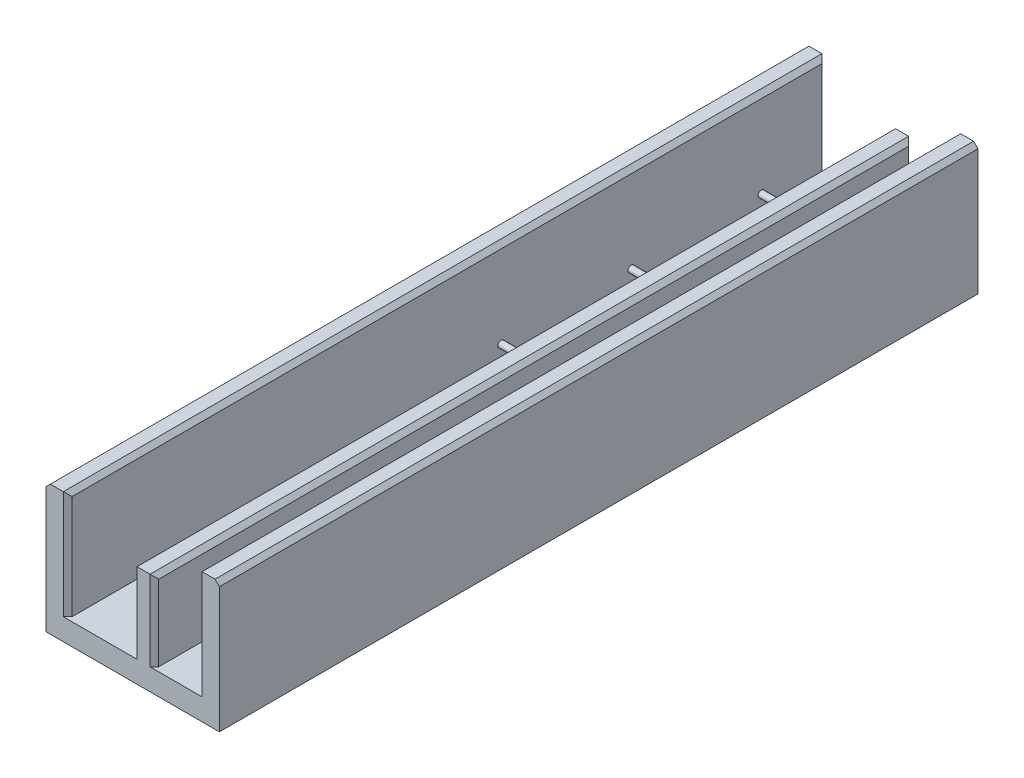
ISO-10303-21;
HEADER;
FILE_DESCRIPTION(('STEP AP214'),'2;1');
FILE_NAME('part.step','',(''),(''),'','','');
FILE_SCHEMA(('AUTOMOTIVE_DESIGN { 1 0 10303 214 1 1 1 1 }'));
ENDSEC;
DATA;
#1=APPLICATION_CONTEXT('core data for automotive mechanical design processes');
#2=APPLICATION_PROTOCOL_DEFINITION('international standard','automotive_design',2000,#1);
#3=PRODUCT_CONTEXT('',#1,'mechanical');
#4=PRODUCT('Part','Part','',(#3));
#5=PRODUCT_RELATED_PRODUCT_CATEGORY('part','',(#4));
#6=PRODUCT_DEFINITION_FORMATION('','',#4);
#7=PRODUCT_DEFINITION_CONTEXT('part definition',#1,'design');
#8=PRODUCT_DEFINITION('design','',#6,#7);
#9=PRODUCT_DEFINITION_SHAPE('','',#8);
#10=(LENGTH_UNIT() NAMED_UNIT(*) SI_UNIT(.MILLI.,.METRE.));
#11=(NAMED_UNIT(*) PLANE_ANGLE_UNIT() SI_UNIT($,.RADIAN.));
#12=(NAMED_UNIT(*) SI_UNIT($,.STERADIAN.) SOLID_ANGLE_UNIT());
#13=UNCERTAINTY_MEASURE_WITH_UNIT(LENGTH_MEASURE(1.E-05),#10,'distance_accuracy_value','');
#14=(GEOMETRIC_REPRESENTATION_CONTEXT(3) GLOBAL_UNCERTAINTY_ASSIGNED_CONTEXT((#13)) GLOBAL_UNIT_ASSIGNED_CONTEXT((#10,
#11,#12)) REPRESENTATION_CONTEXT('',''));
#15=CARTESIAN_POINT('',(0.,0.,0.));
#16=DIRECTION('',(0.,0.,1.));
#17=DIRECTION('',(1.,0.,0.));
#18=AXIS2_PLACEMENT_3D('',#15,#16,#17);
#19=CARTESIAN_POINT('',(0.,600.,3500.));
#20=DIRECTION('',(-1.,0.,0.));
#21=DIRECTION('',(0.,0.,1.));
#22=AXIS2_PLACEMENT_3D('',#19,#20,#21);
#23=PLANE('',#22);
#24=DIRECTION('',(0.,1.,0.));
#25=VECTOR('',#24,1.);
#26=CARTESIAN_POINT('',(0.,600.,0.));
#27=LINE('',#26,#25);
#28=CARTESIAN_POINT('',(0.,0.,0.));
#29=VERTEX_POINT('',#28);
#30=CARTESIAN_POINT('',(0.,580.,0.));
#31=VERTEX_POINT('',#30);
#32=EDGE_CURVE('E219',#29,#31,#27,.T.);
#33=ORIENTED_EDGE('',*,*,#32,.T.);
#34=DIRECTION('',(0.,0.,1.));
#35=VECTOR('',#34,1.);
#36=CARTESIAN_POINT('',(0.,580.,3500.));
#37=LINE('',#36,#35);
#38=CARTESIAN_POINT('',(0.,580.,3500.));
#39=VERTEX_POINT('',#38);
#40=EDGE_CURVE('E289',#31,#39,#37,.T.);
#41=ORIENTED_EDGE('',*,*,#40,.T.);
#42=DIRECTION('',(0.,1.,0.));
#43=VECTOR('',#42,1.);
#44=CARTESIAN_POINT('',(0.,600.,3500.));
#45=LINE('',#44,#43);
#46=CARTESIAN_POINT('',(0.,0.,3500.));
#47=VERTEX_POINT('',#46);
#48=EDGE_CURVE('E238',#47,#39,#45,.T.);
#49=ORIENTED_EDGE('',*,*,#48,.F.);
#50=DIRECTION('',(0.,0.,-1.));
#51=VECTOR('',#50,1.);
#52=CARTESIAN_POINT('',(0.,0.,3500.));
#53=LINE('',#52,#51);
#54=EDGE_CURVE('E210',#47,#29,#53,.T.);
#55=ORIENTED_EDGE('',*,*,#54,.T.);
#56=EDGE_LOOP('',(#33,#41,#49,#55));
#57=FACE_BOUND('',#56,.T.);
#58=ADVANCED_FACE('F37',(#57),#23,.F.);
#59=CARTESIAN_POINT('',(-100.,600.,3500.));
#60=DIRECTION('',(0.,-1.,0.));
#61=DIRECTION('',(0.,0.,-1.));
#62=AXIS2_PLACEMENT_3D('',#59,#60,#61);
#63=PLANE('',#62);
#64=DIRECTION('',(-1.,0.,0.));
#65=VECTOR('',#64,1.);
#66=CARTESIAN_POINT('',(-100.,600.,3500.));
#67=LINE('',#66,#65);
#68=CARTESIAN_POINT('',(-20.,600.,3500.));
#69=VERTEX_POINT('',#68);
#70=CARTESIAN_POINT('',(-80.0000000000002,600.,3500.));
#71=VERTEX_POINT('',#70);
#72=EDGE_CURVE('E369',#69,#71,#67,.T.);
#73=ORIENTED_EDGE('',*,*,#72,.F.);
#74=DIRECTION('',(0.,0.,-1.));
#75=VECTOR('',#74,1.);
#76=CARTESIAN_POINT('',(-20.,600.,3500.));
#77=LINE('',#76,#75);
#78=CARTESIAN_POINT('',(-20.,600.,0.));
#79=VERTEX_POINT('',#78);
#80=EDGE_CURVE('E286',#69,#79,#77,.T.);
#81=ORIENTED_EDGE('',*,*,#80,.T.);
#82=DIRECTION('',(-1.,0.,0.));
#83=VECTOR('',#82,1.);
#84=CARTESIAN_POINT('',(-100.,600.,0.));
#85=LINE('',#84,#83);
#86=CARTESIAN_POINT('',(-80.0000000000002,600.,0.));
#87=VERTEX_POINT('',#86);
#88=EDGE_CURVE('E222',#79,#87,#85,.T.);
#89=ORIENTED_EDGE('',*,*,#88,.T.);
#90=DIRECTION('',(0.,0.,1.));
#91=VECTOR('',#90,1.);
#92=CARTESIAN_POINT('',(-80.0000000000002,600.,3500.));
#93=LINE('',#92,#91);
#94=EDGE_CURVE('E284',#87,#71,#93,.T.);
#95=ORIENTED_EDGE('',*,*,#94,.T.);
#96=EDGE_LOOP('',(#73,#81,#89,#95));
#97=FACE_BOUND('',#96,.T.);
#98=ADVANCED_FACE('F398',(#97),#63,.F.);
#99=CARTESIAN_POINT('',(-100.,99.9999999999998,3500.));
#100=DIRECTION('',(1.,0.,0.));
#101=DIRECTION('',(0.,0.,-1.));
#102=AXIS2_PLACEMENT_3D('',#99,#100,#101);
#103=PLANE('',#102);
#104=CARTESIAN_POINT('',(-100.,200.,1500.));
#105=DIRECTION('',(1.,0.,0.));
#106=DIRECTION('',(0.,0.,-1.));
#107=AXIS2_PLACEMENT_3D('',#104,#105,#106);
#108=CIRCLE('',#107,15.);
#109=CARTESIAN_POINT('',(-100.,200.,1485.));
#110=VERTEX_POINT('',#109);
#111=EDGE_CURVE('E813',#110,#110,#108,.F.);
#112=ORIENTED_EDGE('',*,*,#111,.F.);
#113=EDGE_LOOP('',(#112));
#114=FACE_BOUND('',#113,.T.);
#115=CARTESIAN_POINT('',(-100.,200.,900.));
#116=DIRECTION('',(1.,0.,0.));
#117=DIRECTION('',(0.,0.,-1.));
#118=AXIS2_PLACEMENT_3D('',#115,#116,#117);
#119=CIRCLE('',#118,15.);
#120=CARTESIAN_POINT('',(-100.,200.,885.));
#121=VERTEX_POINT('',#120);
#122=EDGE_CURVE('E803',#121,#121,#119,.F.);
#123=ORIENTED_EDGE('',*,*,#122,.F.);
#124=EDGE_LOOP('',(#123));
#125=FACE_BOUND('',#124,.T.);
#126=CARTESIAN_POINT('',(-100.,200.,300.));
#127=DIRECTION('',(1.,0.,0.));
#128=DIRECTION('',(0.,0.,-1.));
#129=AXIS2_PLACEMENT_3D('',#126,#127,#128);
#130=CIRCLE('',#129,15.);
#131=CARTESIAN_POINT('',(-100.,200.,285.));
#132=VERTEX_POINT('',#131);
#133=EDGE_CURVE('E544',#132,#132,#130,.F.);
#134=ORIENTED_EDGE('',*,*,#133,.F.);
#135=EDGE_LOOP('',(#134));
#136=FACE_BOUND('',#135,.T.);
#137=DIRECTION('',(0.,0.,-1.));
#138=VECTOR('',#137,1.);
#139=CARTESIAN_POINT('',(-100.,580.,3500.));
#140=LINE('',#139,#138);
#141=CARTESIAN_POINT('',(-100.,580.,3480.));
#142=VERTEX_POINT('',#141);
#143=CARTESIAN_POINT('',(-100.,580.,20.));
#144=VERTEX_POINT('',#143);
#145=EDGE_CURVE('E300',#142,#144,#140,.T.);
#146=ORIENTED_EDGE('',*,*,#145,.T.);
#147=DIRECTION('',(0.,-1.,0.));
#148=VECTOR('',#147,1.);
#149=CARTESIAN_POINT('',(-100.,99.9999999999998,20.));
#150=LINE('',#149,#148);
#151=CARTESIAN_POINT('',(-100.,99.9999999999998,20.));
#152=VERTEX_POINT('',#151);
#153=EDGE_CURVE('E302',#144,#152,#150,.T.);
#154=ORIENTED_EDGE('',*,*,#153,.T.);
#155=DIRECTION('',(0.,0.,-1.));
#156=VECTOR('',#155,1.);
#157=CARTESIAN_POINT('',(-100.,99.9999999999998,3500.));
#158=LINE('',#157,#156);
#159=CARTESIAN_POINT('',(-100.,99.9999999999998,3480.));
#160=VERTEX_POINT('',#159);
#161=EDGE_CURVE('E248',#160,#152,#158,.T.);
#162=ORIENTED_EDGE('',*,*,#161,.F.);
#163=DIRECTION('',(0.,1.,0.));
#164=VECTOR('',#163,1.);
#165=CARTESIAN_POINT('',(-100.,99.9999999999998,3480.));
#166=LINE('',#165,#164);
#167=EDGE_CURVE('E298',#160,#142,#166,.T.);
#168=ORIENTED_EDGE('',*,*,#167,.T.);
#169=EDGE_LOOP('',(#146,#154,#162,#168));
#170=FACE_BOUND('',#169,.T.);
#171=ADVANCED_FACE('F418',(#114,#125,#136,#170),#103,.F.);
#172=CARTESIAN_POINT('',(-300.,99.9999999999998,3500.));
#173=DIRECTION('',(0.,-1.,0.));
#174=DIRECTION('',(0.,0.,-1.));
#175=AXIS2_PLACEMENT_3D('',#172,#173,#174);
#176=PLANE('',#175);
#177=DIRECTION('',(-1.,0.,0.));
#178=VECTOR('',#177,1.);
#179=CARTESIAN_POINT('',(-300.,99.9999999999998,0.));
#180=LINE('',#179,#178);
#181=CARTESIAN_POINT('',(-80.0000000000002,99.9999999999998,0.));
#182=VERTEX_POINT('',#181);
#183=CARTESIAN_POINT('',(-320.,99.9999999999998,0.));
#184=VERTEX_POINT('',#183);
#185=EDGE_CURVE('E226',#182,#184,#180,.T.);
#186=ORIENTED_EDGE('',*,*,#185,.T.);
#187=DIRECTION('',(0.70710678118654,0.,0.707106781186555));
#188=VECTOR('',#187,1.);
#189=CARTESIAN_POINT('',(1440.,99.9999999999998,1760.00000000004));
#190=LINE('',#189,#188);
#191=CARTESIAN_POINT('',(-300.,99.9999999999998,20.0000000000005));
#192=VERTEX_POINT('',#191);
#193=EDGE_CURVE('E330',#184,#192,#190,.T.);
#194=ORIENTED_EDGE('',*,*,#193,.T.);
#195=DIRECTION('',(0.,0.,-1.));
#196=VECTOR('',#195,1.);
#197=CARTESIAN_POINT('',(-300.,99.9999999999998,3500.));
#198=LINE('',#197,#196);
#199=CARTESIAN_POINT('',(-300.,99.9999999999998,3480.));
#200=VERTEX_POINT('',#199);
#201=EDGE_CURVE('E245',#200,#192,#198,.T.);
#202=ORIENTED_EDGE('',*,*,#201,.F.);
#203=DIRECTION('',(0.70710678118654,0.,-0.707106781186555));
#204=VECTOR('',#203,1.);
#205=CARTESIAN_POINT('',(-310.,99.9999999999998,3490.));
#206=LINE('',#205,#204);
#207=CARTESIAN_POINT('',(-320.,99.9999999999998,3500.));
#208=VERTEX_POINT('',#207);
#209=EDGE_CURVE('E332',#200,#208,#206,.F.);
#210=ORIENTED_EDGE('',*,*,#209,.T.);
#211=DIRECTION('',(-1.,0.,0.));
#212=VECTOR('',#211,1.);
#213=CARTESIAN_POINT('',(-300.,99.9999999999998,3500.));
#214=LINE('',#213,#212);
#215=CARTESIAN_POINT('',(-80.0000000000002,99.9999999999998,3500.));
#216=VERTEX_POINT('',#215);
#217=EDGE_CURVE('E372',#216,#208,#214,.T.);
#218=ORIENTED_EDGE('',*,*,#217,.F.);
#219=DIRECTION('',(0.707106781186548,0.,0.707106781186548));
#220=VECTOR('',#219,1.);
#221=CARTESIAN_POINT('',(-190.,99.9999999999998,3390.));
#222=LINE('',#221,#220);
#223=EDGE_CURVE('E328',#216,#160,#222,.F.);
#224=ORIENTED_EDGE('',*,*,#223,.T.);
#225=ORIENTED_EDGE('',*,*,#161,.T.);
#226=DIRECTION('',(0.707106781186548,0.,-0.707106781186548));
#227=VECTOR('',#226,1.);
#228=CARTESIAN_POINT('',(-1940.,99.9999999999998,1860.));
#229=LINE('',#228,#227);
#230=EDGE_CURVE('E325',#152,#182,#229,.T.);
#231=ORIENTED_EDGE('',*,*,#230,.T.);
#232=EDGE_LOOP('',(#186,#194,#202,#210,#218,#224,#225,#231));
#233=FACE_BOUND('',#232,.T.);
#234=ADVANCED_FACE('F416',(#233),#176,.F.);
#235=CARTESIAN_POINT('',(-300.,470.,3500.));
#236=DIRECTION('',(-1.,0.,0.));
#237=DIRECTION('',(0.,-1.,0.));
#238=AXIS2_PLACEMENT_3D('',#235,#236,#237);
#239=PLANE('',#238);
#240=CARTESIAN_POINT('',(-300.,200.,1500.));
#241=DIRECTION('',(-1.,0.,0.));
#242=DIRECTION('',(0.,-1.,0.));
#243=AXIS2_PLACEMENT_3D('',#240,#241,#242);
#244=CIRCLE('',#243,15.);
#245=CARTESIAN_POINT('',(-300.,185.,1500.));
#246=VERTEX_POINT('',#245);
#247=EDGE_CURVE('E537',#246,#246,#244,.T.);
#248=ORIENTED_EDGE('',*,*,#247,.T.);
#249=EDGE_LOOP('',(#248));
#250=FACE_BOUND('',#249,.T.);
#251=CARTESIAN_POINT('',(-300.,200.,900.));
#252=DIRECTION('',(-1.,0.,0.));
#253=DIRECTION('',(0.,-1.,0.));
#254=AXIS2_PLACEMENT_3D('',#251,#252,#253);
#255=CIRCLE('',#254,15.);
#256=CARTESIAN_POINT('',(-300.,185.,900.));
#257=VERTEX_POINT('',#256);
#258=EDGE_CURVE('E540',#257,#257,#255,.T.);
#259=ORIENTED_EDGE('',*,*,#258,.T.);
#260=EDGE_LOOP('',(#259));
#261=FACE_BOUND('',#260,.T.);
#262=CARTESIAN_POINT('',(-300.,200.,300.));
#263=DIRECTION('',(-1.,0.,0.));
#264=DIRECTION('',(0.,-1.,0.));
#265=AXIS2_PLACEMENT_3D('',#262,#263,#264);
#266=CIRCLE('',#265,15.);
#267=CARTESIAN_POINT('',(-300.,185.,300.));
#268=VERTEX_POINT('',#267);
#269=EDGE_CURVE('E353',#268,#268,#266,.T.);
#270=ORIENTED_EDGE('',*,*,#269,.T.);
#271=EDGE_LOOP('',(#270));
#272=FACE_BOUND('',#271,.T.);
#273=ORIENTED_EDGE('',*,*,#201,.T.);
#274=DIRECTION('',(0.,1.,0.));
#275=VECTOR('',#274,1.);
#276=CARTESIAN_POINT('',(-300.,470.,20.0000000000005));
#277=LINE('',#276,#275);
#278=CARTESIAN_POINT('',(-300.,449.999999999999,20.0000000000005));
#279=VERTEX_POINT('',#278);
#280=EDGE_CURVE('E309',#192,#279,#277,.T.);
#281=ORIENTED_EDGE('',*,*,#280,.T.);
#282=DIRECTION('',(0.,0.,1.));
#283=VECTOR('',#282,1.);
#284=CARTESIAN_POINT('',(-300.,449.999999999999,3500.));
#285=LINE('',#284,#283);
#286=CARTESIAN_POINT('',(-300.,449.999999999999,3480.));
#287=VERTEX_POINT('',#286);
#288=EDGE_CURVE('E305',#279,#287,#285,.T.);
#289=ORIENTED_EDGE('',*,*,#288,.T.);
#290=DIRECTION('',(0.,-1.,0.));
#291=VECTOR('',#290,1.);
#292=CARTESIAN_POINT('',(-300.,470.,3480.));
#293=LINE('',#292,#291);
#294=EDGE_CURVE('E307',#287,#200,#293,.T.);
#295=ORIENTED_EDGE('',*,*,#294,.T.);
#296=EDGE_LOOP('',(#273,#281,#289,#295));
#297=FACE_BOUND('',#296,.T.);
#298=ADVANCED_FACE('F426',(#250,#261,#272,#297),#239,.F.);
#299=CARTESIAN_POINT('',(-400.,470.,3500.));
#300=DIRECTION('',(0.,-1.,0.));
#301=DIRECTION('',(1.,0.,0.));
#302=AXIS2_PLACEMENT_3D('',#299,#300,#301);
#303=PLANE('',#302);
#304=DIRECTION('',(-1.,0.,0.));
#305=VECTOR('',#304,1.);
#306=CARTESIAN_POINT('',(-400.,470.,3500.));
#307=LINE('',#306,#305);
#308=CARTESIAN_POINT('',(-320.,470.,3500.));
#309=VERTEX_POINT('',#308);
#310=CARTESIAN_POINT('',(-380.,470.,3500.));
#311=VERTEX_POINT('',#310);
#312=EDGE_CURVE('E374',#309,#311,#307,.T.);
#313=ORIENTED_EDGE('',*,*,#312,.F.);
#314=DIRECTION('',(0.,0.,-1.));
#315=VECTOR('',#314,1.);
#316=CARTESIAN_POINT('',(-320.,470.,3500.));
#317=LINE('',#316,#315);
#318=CARTESIAN_POINT('',(-320.,470.,0.));
#319=VERTEX_POINT('',#318);
#320=EDGE_CURVE('E314',#309,#319,#317,.T.);
#321=ORIENTED_EDGE('',*,*,#320,.T.);
#322=DIRECTION('',(-1.,0.,0.));
#323=VECTOR('',#322,1.);
#324=CARTESIAN_POINT('',(-400.,470.,0.));
#325=LINE('',#324,#323);
#326=CARTESIAN_POINT('',(-380.,470.,0.));
#327=VERTEX_POINT('',#326);
#328=EDGE_CURVE('E228',#319,#327,#325,.T.);
#329=ORIENTED_EDGE('',*,*,#328,.T.);
#330=DIRECTION('',(0.,0.,1.));
#331=VECTOR('',#330,1.);
#332=CARTESIAN_POINT('',(-380.,470.,3500.));
#333=LINE('',#332,#331);
#334=EDGE_CURVE('E312',#327,#311,#333,.T.);
#335=ORIENTED_EDGE('',*,*,#334,.T.);
#336=EDGE_LOOP('',(#313,#321,#329,#335));
#337=FACE_BOUND('',#336,.T.);
#338=ADVANCED_FACE('F487',(#337),#303,.F.);
#339=CARTESIAN_POINT('',(-400.,99.9999999999999,3500.));
#340=DIRECTION('',(1.,0.,0.));
#341=DIRECTION('',(0.,0.,-1.));
#342=AXIS2_PLACEMENT_3D('',#339,#340,#341);
#343=PLANE('',#342);
#344=CARTESIAN_POINT('',(-400.,200.,1500.));
#345=DIRECTION('',(1.,0.,0.));
#346=DIRECTION('',(0.,0.,-1.));
#347=AXIS2_PLACEMENT_3D('',#344,#345,#346);
#348=CIRCLE('',#347,15.);
#349=CARTESIAN_POINT('',(-400.,200.,1485.));
#350=VERTEX_POINT('',#349);
#351=EDGE_CURVE('E808',#350,#350,#348,.T.);
#352=ORIENTED_EDGE('',*,*,#351,.T.);
#353=EDGE_LOOP('',(#352));
#354=FACE_BOUND('',#353,.T.);
#355=CARTESIAN_POINT('',(-400.,200.,900.));
#356=DIRECTION('',(1.,0.,0.));
#357=DIRECTION('',(0.,0.,-1.));
#358=AXIS2_PLACEMENT_3D('',#355,#356,#357);
#359=CIRCLE('',#358,15.);
#360=CARTESIAN_POINT('',(-400.,200.,885.));
#361=VERTEX_POINT('',#360);
#362=EDGE_CURVE('E545',#361,#361,#359,.T.);
#363=ORIENTED_EDGE('',*,*,#362,.T.);
#364=EDGE_LOOP('',(#363));
#365=FACE_BOUND('',#364,.T.);
#366=CARTESIAN_POINT('',(-400.,200.,300.));
#367=DIRECTION('',(1.,0.,0.));
#368=DIRECTION('',(0.,0.,-1.));
#369=AXIS2_PLACEMENT_3D('',#366,#367,#368);
#370=CIRCLE('',#369,15.);
#371=CARTESIAN_POINT('',(-400.,200.,285.));
#372=VERTEX_POINT('',#371);
#373=EDGE_CURVE('E359',#372,#372,#370,.T.);
#374=ORIENTED_EDGE('',*,*,#373,.T.);
#375=EDGE_LOOP('',(#374));
#376=FACE_BOUND('',#375,.T.);
#377=DIRECTION('',(0.,0.,-1.));
#378=VECTOR('',#377,1.);
#379=CARTESIAN_POINT('',(-400.,450.,3500.));
#380=LINE('',#379,#378);
#381=CARTESIAN_POINT('',(-400.,450.,3480.));
#382=VERTEX_POINT('',#381);
#383=CARTESIAN_POINT('',(-400.,450.,19.9999999999996));
#384=VERTEX_POINT('',#383);
#385=EDGE_CURVE('E54',#382,#384,#380,.T.);
#386=ORIENTED_EDGE('',*,*,#385,.T.);
#387=DIRECTION('',(0.,-1.,0.));
#388=VECTOR('',#387,1.);
#389=CARTESIAN_POINT('',(-400.,99.9999999999999,19.9999999999996));
#390=LINE('',#389,#388);
#391=CARTESIAN_POINT('',(-400.,99.9999999999999,19.9999999999996));
#392=VERTEX_POINT('',#391);
#393=EDGE_CURVE('E318',#384,#392,#390,.T.);
#394=ORIENTED_EDGE('',*,*,#393,.T.);
#395=DIRECTION('',(0.,0.,-1.));
#396=VECTOR('',#395,1.);
#397=CARTESIAN_POINT('',(-400.,99.9999999999999,3500.));
#398=LINE('',#397,#396);
#399=CARTESIAN_POINT('',(-400.,99.9999999999999,3480.));
#400=VERTEX_POINT('',#399);
#401=EDGE_CURVE('E242',#400,#392,#398,.T.);
#402=ORIENTED_EDGE('',*,*,#401,.F.);
#403=DIRECTION('',(0.,1.,0.));
#404=VECTOR('',#403,1.);
#405=CARTESIAN_POINT('',(-400.,99.9999999999999,3480.));
#406=LINE('',#405,#404);
#407=EDGE_CURVE('E59',#400,#382,#406,.T.);
#408=ORIENTED_EDGE('',*,*,#407,.T.);
#409=EDGE_LOOP('',(#386,#394,#402,#408));
#410=FACE_BOUND('',#409,.T.);
#411=ADVANCED_FACE('F498',(#354,#365,#376,#410),#343,.F.);
#412=CARTESIAN_POINT('',(-700.,99.9999999999999,3500.));
#413=DIRECTION('',(0.,-1.,0.));
#414=DIRECTION('',(1.,0.,0.));
#415=AXIS2_PLACEMENT_3D('',#412,#413,#414);
#416=PLANE('',#415);
#417=DIRECTION('',(-1.,0.,0.));
#418=VECTOR('',#417,1.);
#419=CARTESIAN_POINT('',(-700.,99.9999999999999,0.));
#420=LINE('',#419,#418);
#421=CARTESIAN_POINT('',(-380.,99.9999999999999,0.));
#422=VERTEX_POINT('',#421);
#423=CARTESIAN_POINT('',(-720.,99.9999999999999,0.));
#424=VERTEX_POINT('',#423);
#425=EDGE_CURVE('E231',#422,#424,#420,.T.);
#426=ORIENTED_EDGE('',*,*,#425,.T.);
#427=DIRECTION('',(0.707106781186549,0.,0.707106781186546));
#428=VECTOR('',#427,1.);
#429=CARTESIAN_POINT('',(1040.,99.9999999999999,1759.99999999999));
#430=LINE('',#429,#428);
#431=CARTESIAN_POINT('',(-700.,99.9999999999999,20.));
#432=VERTEX_POINT('',#431);
#433=EDGE_CURVE('E320',#424,#432,#430,.T.);
#434=ORIENTED_EDGE('',*,*,#433,.T.);
#435=DIRECTION('',(0.,0.,-1.));
#436=VECTOR('',#435,1.);
#437=CARTESIAN_POINT('',(-700.,99.9999999999999,3500.));
#438=LINE('',#437,#436);
#439=CARTESIAN_POINT('',(-700.,99.9999999999999,3480.));
#440=VERTEX_POINT('',#439);
#441=EDGE_CURVE('E209',#440,#432,#438,.T.);
#442=ORIENTED_EDGE('',*,*,#441,.F.);
#443=DIRECTION('',(0.707106781186549,0.,-0.707106781186546));
#444=VECTOR('',#443,1.);
#445=CARTESIAN_POINT('',(-710.,99.9999999999999,3490.));
#446=LINE('',#445,#444);
#447=CARTESIAN_POINT('',(-720.,99.9999999999999,3500.));
#448=VERTEX_POINT('',#447);
#449=EDGE_CURVE('E322',#440,#448,#446,.F.);
#450=ORIENTED_EDGE('',*,*,#449,.T.);
#451=DIRECTION('',(-1.,0.,0.));
#452=VECTOR('',#451,1.);
#453=CARTESIAN_POINT('',(-700.,99.9999999999999,3500.));
#454=LINE('',#453,#452);
#455=CARTESIAN_POINT('',(-380.,99.9999999999999,3500.));
#456=VERTEX_POINT('',#455);
#457=EDGE_CURVE('E377',#456,#448,#454,.T.);
#458=ORIENTED_EDGE('',*,*,#457,.F.);
#459=DIRECTION('',(0.707106781186555,0.,0.70710678118654));
#460=VECTOR('',#459,1.);
#461=CARTESIAN_POINT('',(-540.000000000004,99.9999999999999,3340.));
#462=LINE('',#461,#460);
#463=EDGE_CURVE('E11',#456,#400,#462,.F.);
#464=ORIENTED_EDGE('',*,*,#463,.T.);
#465=ORIENTED_EDGE('',*,*,#401,.T.);
#466=DIRECTION('',(0.707106781186555,0.,-0.70710678118654));
#467=VECTOR('',#466,1.);
#468=CARTESIAN_POINT('',(-2290.,99.9999999999998,1909.99999999996));
#469=LINE('',#468,#467);
#470=EDGE_CURVE('E46',#392,#422,#469,.T.);
#471=ORIENTED_EDGE('',*,*,#470,.T.);
#472=EDGE_LOOP('',(#426,#434,#442,#450,#458,#464,#465,#471));
#473=FACE_BOUND('',#472,.T.);
#474=ADVANCED_FACE('F499',(#473),#416,.F.);
#475=CARTESIAN_POINT('',(-700.,600.,3500.));
#476=DIRECTION('',(-1.,0.,0.));
#477=DIRECTION('',(0.,-1.,0.));
#478=AXIS2_PLACEMENT_3D('',#475,#476,#477);
#479=PLANE('',#478);
#480=CARTESIAN_POINT('',(-700.,200.,1500.));
#481=DIRECTION('',(-1.,0.,0.));
#482=DIRECTION('',(0.,-1.,0.));
#483=AXIS2_PLACEMENT_3D('',#480,#481,#482);
#484=CIRCLE('',#483,15.);
#485=CARTESIAN_POINT('',(-700.,185.,1500.));
#486=VERTEX_POINT('',#485);
#487=EDGE_CURVE('E811',#486,#486,#484,.T.);
#488=ORIENTED_EDGE('',*,*,#487,.T.);
#489=EDGE_LOOP('',(#488));
#490=FACE_BOUND('',#489,.T.);
#491=CARTESIAN_POINT('',(-700.,200.,900.));
#492=DIRECTION('',(-1.,0.,0.));
#493=DIRECTION('',(0.,-1.,0.));
#494=AXIS2_PLACEMENT_3D('',#491,#492,#493);
#495=CIRCLE('',#494,15.);
#496=CARTESIAN_POINT('',(-700.,185.,900.));
#497=VERTEX_POINT('',#496);
#498=EDGE_CURVE('E550',#497,#497,#495,.T.);
#499=ORIENTED_EDGE('',*,*,#498,.T.);
#500=EDGE_LOOP('',(#499));
#501=FACE_BOUND('',#500,.T.);
#502=CARTESIAN_POINT('',(-700.,200.,300.));
#503=DIRECTION('',(-1.,0.,0.));
#504=DIRECTION('',(0.,-1.,0.));
#505=AXIS2_PLACEMENT_3D('',#502,#503,#504);
#506=CIRCLE('',#505,15.);
#507=CARTESIAN_POINT('',(-700.,185.,300.));
#508=VERTEX_POINT('',#507);
#509=EDGE_CURVE('E364',#508,#508,#506,.T.);
#510=ORIENTED_EDGE('',*,*,#509,.T.);
#511=EDGE_LOOP('',(#510));
#512=FACE_BOUND('',#511,.T.);
#513=ORIENTED_EDGE('',*,*,#441,.T.);
#514=DIRECTION('',(0.,1.,0.));
#515=VECTOR('',#514,1.);
#516=CARTESIAN_POINT('',(-700.,600.,20.));
#517=LINE('',#516,#515);
#518=CARTESIAN_POINT('',(-700.,580.,20.));
#519=VERTEX_POINT('',#518);
#520=EDGE_CURVE('E295',#432,#519,#517,.T.);
#521=ORIENTED_EDGE('',*,*,#520,.T.);
#522=DIRECTION('',(0.,0.,1.));
#523=VECTOR('',#522,1.);
#524=CARTESIAN_POINT('',(-700.,580.,3500.));
#525=LINE('',#524,#523);
#526=CARTESIAN_POINT('',(-700.,580.,3480.));
#527=VERTEX_POINT('',#526);
#528=EDGE_CURVE('E293',#519,#527,#525,.T.);
#529=ORIENTED_EDGE('',*,*,#528,.T.);
#530=DIRECTION('',(0.,-1.,0.));
#531=VECTOR('',#530,1.);
#532=CARTESIAN_POINT('',(-700.,600.,3480.));
#533=LINE('',#532,#531);
#534=EDGE_CURVE('E291',#527,#440,#533,.T.);
#535=ORIENTED_EDGE('',*,*,#534,.T.);
#536=EDGE_LOOP('',(#513,#521,#529,#535));
#537=FACE_BOUND('',#536,.T.);
#538=ADVANCED_FACE('F511',(#490,#501,#512,#537),#479,.F.);
#539=CARTESIAN_POINT('',(-800.,600.,3500.));
#540=DIRECTION('',(0.,-1.,0.));
#541=DIRECTION('',(0.,0.,-1.));
#542=AXIS2_PLACEMENT_3D('',#539,#540,#541);
#543=PLANE('',#542);
#544=DIRECTION('',(-1.,0.,0.));
#545=VECTOR('',#544,1.);
#546=CARTESIAN_POINT('',(-800.,600.,0.));
#547=LINE('',#546,#545);
#548=CARTESIAN_POINT('',(-720.,600.,0.));
#549=VERTEX_POINT('',#548);
#550=CARTESIAN_POINT('',(-780.,600.,0.));
#551=VERTEX_POINT('',#550);
#552=EDGE_CURVE('E233',#549,#551,#547,.T.);
#553=ORIENTED_EDGE('',*,*,#552,.T.);
#554=DIRECTION('',(0.,0.,1.));
#555=VECTOR('',#554,1.);
#556=CARTESIAN_POINT('',(-780.,600.,3500.));
#557=LINE('',#556,#555);
#558=CARTESIAN_POINT('',(-780.,600.,3500.));
#559=VERTEX_POINT('',#558);
#560=EDGE_CURVE('E269',#551,#559,#557,.T.);
#561=ORIENTED_EDGE('',*,*,#560,.T.);
#562=DIRECTION('',(-1.,0.,0.));
#563=VECTOR('',#562,1.);
#564=CARTESIAN_POINT('',(-800.,600.,3500.));
#565=LINE('',#564,#563);
#566=CARTESIAN_POINT('',(-720.,600.,3500.));
#567=VERTEX_POINT('',#566);
#568=EDGE_CURVE('E200',#567,#559,#565,.T.);
#569=ORIENTED_EDGE('',*,*,#568,.F.);
#570=DIRECTION('',(0.,0.,-1.));
#571=VECTOR('',#570,1.);
#572=CARTESIAN_POINT('',(-720.,600.,3500.));
#573=LINE('',#572,#571);
#574=EDGE_CURVE('E267',#567,#549,#573,.T.);
#575=ORIENTED_EDGE('',*,*,#574,.T.);
#576=EDGE_LOOP('',(#553,#561,#569,#575));
#577=FACE_BOUND('',#576,.T.);
#578=ADVANCED_FACE('F506',(#577),#543,.F.);
#579=CARTESIAN_POINT('',(-800.,0.,3500.));
#580=DIRECTION('',(1.,0.,0.));
#581=DIRECTION('',(0.,0.,-1.));
#582=AXIS2_PLACEMENT_3D('',#579,#580,#581);
#583=PLANE('',#582);
#584=DIRECTION('',(0.,-1.,0.));
#585=VECTOR('',#584,1.);
#586=CARTESIAN_POINT('',(-800.,0.,3500.));
#587=LINE('',#586,#585);
#588=CARTESIAN_POINT('',(-800.,580.,3500.));
#589=VERTEX_POINT('',#588);
#590=CARTESIAN_POINT('',(-800.,0.,3500.));
#591=VERTEX_POINT('',#590);
#592=EDGE_CURVE('E187',#589,#591,#587,.T.);
#593=ORIENTED_EDGE('',*,*,#592,.F.);
#594=DIRECTION('',(0.,0.,-1.));
#595=VECTOR('',#594,1.);
#596=CARTESIAN_POINT('',(-800.,580.,3500.));
#597=LINE('',#596,#595);
#598=CARTESIAN_POINT('',(-800.,580.,0.));
#599=VERTEX_POINT('',#598);
#600=EDGE_CURVE('E251',#589,#599,#597,.T.);
#601=ORIENTED_EDGE('',*,*,#600,.T.);
#602=DIRECTION('',(0.,-1.,0.));
#603=VECTOR('',#602,1.);
#604=CARTESIAN_POINT('',(-800.,0.,0.));
#605=LINE('',#604,#603);
#606=CARTESIAN_POINT('',(-800.,0.,0.));
#607=VERTEX_POINT('',#606);
#608=EDGE_CURVE('E206',#599,#607,#605,.T.);
#609=ORIENTED_EDGE('',*,*,#608,.T.);
#610=DIRECTION('',(0.,0.,-1.));
#611=VECTOR('',#610,1.);
#612=CARTESIAN_POINT('',(-800.,0.,3500.));
#613=LINE('',#612,#611);
#614=EDGE_CURVE('E203',#591,#607,#613,.T.);
#615=ORIENTED_EDGE('',*,*,#614,.F.);
#616=EDGE_LOOP('',(#593,#601,#609,#615));
#617=FACE_BOUND('',#616,.T.);
#618=ADVANCED_FACE('F204',(#617),#583,.F.);
#619=CARTESIAN_POINT('',(0.,0.,3500.));
#620=DIRECTION('',(0.,1.,0.));
#621=DIRECTION('',(-1.,0.,0.));
#622=AXIS2_PLACEMENT_3D('',#619,#620,#621);
#623=PLANE('',#622);
#624=DIRECTION('',(1.,0.,0.));
#625=VECTOR('',#624,1.);
#626=CARTESIAN_POINT('',(0.,0.,0.));
#627=LINE('',#626,#625);
#628=EDGE_CURVE('E237',#607,#29,#627,.T.);
#629=ORIENTED_EDGE('',*,*,#628,.T.);
#630=ORIENTED_EDGE('',*,*,#54,.F.);
#631=DIRECTION('',(1.,0.,0.));
#632=VECTOR('',#631,1.);
#633=CARTESIAN_POINT('',(0.,0.,3500.));
#634=LINE('',#633,#632);
#635=EDGE_CURVE('E193',#591,#47,#634,.T.);
#636=ORIENTED_EDGE('',*,*,#635,.F.);
#637=ORIENTED_EDGE('',*,*,#614,.T.);
#638=EDGE_LOOP('',(#629,#630,#636,#637));
#639=FACE_BOUND('',#638,.T.);
#640=ADVANCED_FACE('F212',(#639),#623,.F.);
#641=CARTESIAN_POINT('',(0.,0.,3500.));
#642=DIRECTION('',(0.,0.,-1.));
#643=DIRECTION('',(-1.,0.,0.));
#644=AXIS2_PLACEMENT_3D('',#641,#642,#643);
#645=PLANE('',#644);
#646=ORIENTED_EDGE('',*,*,#568,.T.);
#647=DIRECTION('',(0.707106781186548,0.707106781186548,0.));
#648=VECTOR('',#647,1.);
#649=CARTESIAN_POINT('',(-800.,580.,3500.));
#650=LINE('',#649,#648);
#651=EDGE_CURVE('E196',#559,#589,#650,.F.);
#652=ORIENTED_EDGE('',*,*,#651,.T.);
#653=ORIENTED_EDGE('',*,*,#592,.T.);
#654=ORIENTED_EDGE('',*,*,#635,.T.);
#655=ORIENTED_EDGE('',*,*,#48,.T.);
#656=DIRECTION('',(0.707106781186548,-0.707106781186548,0.));
#657=VECTOR('',#656,1.);
#658=CARTESIAN_POINT('',(-20.,600.,3500.));
#659=LINE('',#658,#657);
#660=EDGE_CURVE('E281',#39,#69,#659,.F.);
#661=ORIENTED_EDGE('',*,*,#660,.T.);
#662=ORIENTED_EDGE('',*,*,#72,.T.);
#663=DIRECTION('',(0.,-1.,0.));
#664=VECTOR('',#663,1.);
#665=CARTESIAN_POINT('',(-80.0000000000002,0.,3500.));
#666=LINE('',#665,#664);
#667=EDGE_CURVE('E276',#71,#216,#666,.T.);
#668=ORIENTED_EDGE('',*,*,#667,.T.);
#669=ORIENTED_EDGE('',*,*,#217,.T.);
#670=DIRECTION('',(0.,1.,0.));
#671=VECTOR('',#670,1.);
#672=CARTESIAN_POINT('',(-320.,0.,3500.));
#673=LINE('',#672,#671);
#674=EDGE_CURVE('E274',#208,#309,#673,.T.);
#675=ORIENTED_EDGE('',*,*,#674,.T.);
#676=ORIENTED_EDGE('',*,*,#312,.T.);
#677=DIRECTION('',(0.,-1.,0.));
#678=VECTOR('',#677,1.);
#679=CARTESIAN_POINT('',(-380.,0.,3500.));
#680=LINE('',#679,#678);
#681=EDGE_CURVE('E271',#311,#456,#680,.T.);
#682=ORIENTED_EDGE('',*,*,#681,.T.);
#683=ORIENTED_EDGE('',*,*,#457,.T.);
#684=DIRECTION('',(0.,1.,0.));
#685=VECTOR('',#684,1.);
#686=CARTESIAN_POINT('',(-720.,1.59872115546023E-13,3500.));
#687=LINE('',#686,#685);
#688=EDGE_CURVE('E279',#448,#567,#687,.T.);
#689=ORIENTED_EDGE('',*,*,#688,.T.);
#690=EDGE_LOOP('',(#646,#652,#653,#654,#655,#661,#662,#668,#669,#675,#676,#682,#683,#689));
#691=FACE_BOUND('',#690,.T.);
#692=ADVANCED_FACE('F190',(#691),#645,.F.);
#693=CARTESIAN_POINT('',(0.,0.,0.));
#694=DIRECTION('',(0.,0.,-1.));
#695=DIRECTION('',(-1.,0.,0.));
#696=AXIS2_PLACEMENT_3D('',#693,#694,#695);
#697=PLANE('',#696);
#698=ORIENTED_EDGE('',*,*,#608,.F.);
#699=DIRECTION('',(-0.707106781186548,-0.707106781186548,0.));
#700=VECTOR('',#699,1.);
#701=CARTESIAN_POINT('',(-690.,690.,0.));
#702=LINE('',#701,#700);
#703=EDGE_CURVE('E265',#599,#551,#702,.F.);
#704=ORIENTED_EDGE('',*,*,#703,.T.);
#705=ORIENTED_EDGE('',*,*,#552,.F.);
#706=DIRECTION('',(0.,-1.,0.));
#707=VECTOR('',#706,1.);
#708=CARTESIAN_POINT('',(-720.,99.9999999999999,0.));
#709=LINE('',#708,#707);
#710=EDGE_CURVE('E260',#549,#424,#709,.T.);
#711=ORIENTED_EDGE('',*,*,#710,.T.);
#712=ORIENTED_EDGE('',*,*,#425,.F.);
#713=DIRECTION('',(0.,1.,0.));
#714=VECTOR('',#713,1.);
#715=CARTESIAN_POINT('',(-380.,470.,0.));
#716=LINE('',#715,#714);
#717=EDGE_CURVE('E253',#422,#327,#716,.T.);
#718=ORIENTED_EDGE('',*,*,#717,.T.);
#719=ORIENTED_EDGE('',*,*,#328,.F.);
#720=DIRECTION('',(0.,-1.,0.));
#721=VECTOR('',#720,1.);
#722=CARTESIAN_POINT('',(-320.,99.9999999999998,0.));
#723=LINE('',#722,#721);
#724=EDGE_CURVE('E255',#319,#184,#723,.T.);
#725=ORIENTED_EDGE('',*,*,#724,.T.);
#726=ORIENTED_EDGE('',*,*,#185,.F.);
#727=DIRECTION('',(0.,1.,0.));
#728=VECTOR('',#727,1.);
#729=CARTESIAN_POINT('',(-80.0000000000002,600.,0.));
#730=LINE('',#729,#728);
#731=EDGE_CURVE('E258',#182,#87,#730,.T.);
#732=ORIENTED_EDGE('',*,*,#731,.T.);
#733=ORIENTED_EDGE('',*,*,#88,.F.);
#734=DIRECTION('',(-0.707106781186548,0.707106781186548,0.));
#735=VECTOR('',#734,1.);
#736=CARTESIAN_POINT('',(290.,290.,0.));
#737=LINE('',#736,#735);
#738=EDGE_CURVE('E263',#79,#31,#737,.F.);
#739=ORIENTED_EDGE('',*,*,#738,.T.);
#740=ORIENTED_EDGE('',*,*,#32,.F.);
#741=ORIENTED_EDGE('',*,*,#628,.F.);
#742=EDGE_LOOP('',(#698,#704,#705,#711,#712,#718,#719,#725,#726,#732,#733,#739,#740,#741));
#743=FACE_BOUND('',#742,.T.);
#744=ADVANCED_FACE('F386',(#743),#697,.T.);
#745=CARTESIAN_POINT('',(-800.,580.,3500.));
#746=DIRECTION('',(0.707106781186547,-0.707106781186547,0.));
#747=DIRECTION('',(0.,0.,-1.));
#748=AXIS2_PLACEMENT_3D('',#745,#746,#747);
#749=PLANE('',#748);
#750=ORIENTED_EDGE('',*,*,#651,.F.);
#751=ORIENTED_EDGE('',*,*,#560,.F.);
#752=ORIENTED_EDGE('',*,*,#703,.F.);
#753=ORIENTED_EDGE('',*,*,#600,.F.);
#754=EDGE_LOOP('',(#750,#751,#752,#753));
#755=FACE_BOUND('',#754,.T.);
#756=ADVANCED_FACE('F384',(#755),#749,.F.);
#757=CARTESIAN_POINT('',(-20.,600.,3500.));
#758=DIRECTION('',(-0.707106781186547,-0.707106781186547,0.));
#759=DIRECTION('',(0.,0.,-1.));
#760=AXIS2_PLACEMENT_3D('',#757,#758,#759);
#761=PLANE('',#760);
#762=ORIENTED_EDGE('',*,*,#660,.F.);
#763=ORIENTED_EDGE('',*,*,#40,.F.);
#764=ORIENTED_EDGE('',*,*,#738,.F.);
#765=ORIENTED_EDGE('',*,*,#80,.F.);
#766=EDGE_LOOP('',(#762,#763,#764,#765));
#767=FACE_BOUND('',#766,.T.);
#768=ADVANCED_FACE('F395',(#767),#761,.F.);
#769=CARTESIAN_POINT('',(-720.,1.59872115546023E-13,3500.));
#770=DIRECTION('',(-0.707106781186546,0.,-0.707106781186549));
#771=DIRECTION('',(0.,1.,0.));
#772=AXIS2_PLACEMENT_3D('',#769,#770,#771);
#773=PLANE('',#772);
#774=ORIENTED_EDGE('',*,*,#449,.F.);
#775=ORIENTED_EDGE('',*,*,#534,.F.);
#776=DIRECTION('',(-0.577350269189627,0.577350269189627,0.577350269189624));
#777=VECTOR('',#776,1.);
#778=CARTESIAN_POINT('',(-520.,400.,3300.));
#779=LINE('',#778,#777);
#780=EDGE_CURVE('E223',#567,#527,#779,.F.);
#781=ORIENTED_EDGE('',*,*,#780,.F.);
#782=ORIENTED_EDGE('',*,*,#688,.F.);
#783=EDGE_LOOP('',(#774,#775,#781,#782));
#784=FACE_BOUND('',#783,.T.);
#785=ADVANCED_FACE('F440',(#784),#773,.F.);
#786=CARTESIAN_POINT('',(-720.,600.,3500.));
#787=DIRECTION('',(-0.707106781186547,-0.707106781186547,0.));
#788=DIRECTION('',(0.,0.,-1.));
#789=AXIS2_PLACEMENT_3D('',#786,#787,#788);
#790=PLANE('',#789);
#791=ORIENTED_EDGE('',*,*,#780,.T.);
#792=ORIENTED_EDGE('',*,*,#528,.F.);
#793=DIRECTION('',(0.577350269189627,-0.577350269189627,0.577350269189624));
#794=VECTOR('',#793,1.);
#795=CARTESIAN_POINT('',(446.666666666665,-566.666666666665,1166.66666666666));
#796=LINE('',#795,#794);
#797=EDGE_CURVE('E337',#549,#519,#796,.T.);
#798=ORIENTED_EDGE('',*,*,#797,.F.);
#799=ORIENTED_EDGE('',*,*,#574,.F.);
#800=EDGE_LOOP('',(#791,#792,#798,#799));
#801=FACE_BOUND('',#800,.T.);
#802=ADVANCED_FACE('F444',(#801),#790,.F.);
#803=CARTESIAN_POINT('',(-700.,600.,20.));
#804=DIRECTION('',(0.707106781186546,0.,-0.707106781186549));
#805=DIRECTION('',(0.,-1.,0.));
#806=AXIS2_PLACEMENT_3D('',#803,#804,#805);
#807=PLANE('',#806);
#808=ORIENTED_EDGE('',*,*,#433,.F.);
#809=ORIENTED_EDGE('',*,*,#710,.F.);
#810=ORIENTED_EDGE('',*,*,#797,.T.);
#811=ORIENTED_EDGE('',*,*,#520,.F.);
#812=EDGE_LOOP('',(#808,#809,#810,#811));
#813=FACE_BOUND('',#812,.T.);
#814=ADVANCED_FACE('F441',(#813),#807,.T.);
#815=CARTESIAN_POINT('',(-80.0000000000002,0.,3500.));
#816=DIRECTION('',(0.707106781186547,0.,-0.707106781186547));
#817=DIRECTION('',(0.,-1.,0.));
#818=AXIS2_PLACEMENT_3D('',#815,#816,#817);
#819=PLANE('',#818);
#820=ORIENTED_EDGE('',*,*,#223,.F.);
#821=ORIENTED_EDGE('',*,*,#667,.F.);
#822=DIRECTION('',(-0.577350269189626,-0.577350269189626,-0.577350269189626));
#823=VECTOR('',#822,1.);
#824=CARTESIAN_POINT('',(-280.,400.,3300.));
#825=LINE('',#824,#823);
#826=EDGE_CURVE('E339',#142,#71,#825,.F.);
#827=ORIENTED_EDGE('',*,*,#826,.F.);
#828=ORIENTED_EDGE('',*,*,#167,.F.);
#829=EDGE_LOOP('',(#820,#821,#827,#828));
#830=FACE_BOUND('',#829,.T.);
#831=ADVANCED_FACE('F412',(#830),#819,.F.);
#832=CARTESIAN_POINT('',(-100.,580.,3500.));
#833=DIRECTION('',(0.707106781186547,-0.707106781186547,0.));
#834=DIRECTION('',(0.,0.,-1.));
#835=AXIS2_PLACEMENT_3D('',#832,#833,#834);
#836=PLANE('',#835);
#837=ORIENTED_EDGE('',*,*,#826,.T.);
#838=ORIENTED_EDGE('',*,*,#94,.F.);
#839=DIRECTION('',(0.577350269189626,0.577350269189626,-0.577350269189626));
#840=VECTOR('',#839,1.);
#841=CARTESIAN_POINT('',(-1260.,-580.,1180.));
#842=LINE('',#841,#840);
#843=EDGE_CURVE('E342',#144,#87,#842,.T.);
#844=ORIENTED_EDGE('',*,*,#843,.F.);
#845=ORIENTED_EDGE('',*,*,#145,.F.);
#846=EDGE_LOOP('',(#837,#838,#844,#845));
#847=FACE_BOUND('',#846,.T.);
#848=ADVANCED_FACE('F407',(#847),#836,.F.);
#849=CARTESIAN_POINT('',(-100.,99.9999999999998,20.));
#850=DIRECTION('',(-0.707106781186547,0.,-0.707106781186547));
#851=DIRECTION('',(0.,1.,0.));
#852=AXIS2_PLACEMENT_3D('',#849,#850,#851);
#853=PLANE('',#852);
#854=ORIENTED_EDGE('',*,*,#843,.T.);
#855=ORIENTED_EDGE('',*,*,#731,.F.);
#856=ORIENTED_EDGE('',*,*,#230,.F.);
#857=ORIENTED_EDGE('',*,*,#153,.F.);
#858=EDGE_LOOP('',(#854,#855,#856,#857));
#859=FACE_BOUND('',#858,.T.);
#860=ADVANCED_FACE('F402',(#859),#853,.T.);
#861=CARTESIAN_POINT('',(-320.,0.,3500.));
#862=DIRECTION('',(-0.707106781186555,0.,-0.70710678118654));
#863=DIRECTION('',(0.,1.,0.));
#864=AXIS2_PLACEMENT_3D('',#861,#862,#863);
#865=PLANE('',#864);
#866=ORIENTED_EDGE('',*,*,#209,.F.);
#867=ORIENTED_EDGE('',*,*,#294,.F.);
#868=DIRECTION('',(0.577350269189617,-0.57735026918963,-0.57735026918963));
#869=VECTOR('',#868,1.);
#870=CARTESIAN_POINT('',(-320.,470.,3500.));
#871=LINE('',#870,#869);
#872=EDGE_CURVE('E345',#309,#287,#871,.T.);
#873=ORIENTED_EDGE('',*,*,#872,.F.);
#874=ORIENTED_EDGE('',*,*,#674,.F.);
#875=EDGE_LOOP('',(#866,#867,#873,#874));
#876=FACE_BOUND('',#875,.T.);
#877=ADVANCED_FACE('F454',(#876),#865,.F.);
#878=CARTESIAN_POINT('',(-320.,470.,3500.));
#879=DIRECTION('',(-0.707106781186555,-0.70710678118654,0.));
#880=DIRECTION('',(0.,0.,-1.));
#881=AXIS2_PLACEMENT_3D('',#878,#879,#880);
#882=PLANE('',#881);
#883=ORIENTED_EDGE('',*,*,#872,.T.);
#884=ORIENTED_EDGE('',*,*,#288,.F.);
#885=DIRECTION('',(0.577350269189617,-0.57735026918963,0.57735026918963));
#886=VECTOR('',#885,1.);
#887=CARTESIAN_POINT('',(846.666666666658,-696.666666666684,1166.66666666668));
#888=LINE('',#887,#886);
#889=EDGE_CURVE('E348',#319,#279,#888,.T.);
#890=ORIENTED_EDGE('',*,*,#889,.F.);
#891=ORIENTED_EDGE('',*,*,#320,.F.);
#892=EDGE_LOOP('',(#883,#884,#890,#891));
#893=FACE_BOUND('',#892,.T.);
#894=ADVANCED_FACE('F462',(#893),#882,.F.);
#895=CARTESIAN_POINT('',(-300.,470.,20.0000000000005));
#896=DIRECTION('',(0.707106781186555,0.,-0.70710678118654));
#897=DIRECTION('',(0.,-1.,0.));
#898=AXIS2_PLACEMENT_3D('',#895,#896,#897);
#899=PLANE('',#898);
#900=ORIENTED_EDGE('',*,*,#193,.F.);
#901=ORIENTED_EDGE('',*,*,#724,.F.);
#902=ORIENTED_EDGE('',*,*,#889,.T.);
#903=ORIENTED_EDGE('',*,*,#280,.F.);
#904=EDGE_LOOP('',(#900,#901,#902,#903));
#905=FACE_BOUND('',#904,.T.);
#906=ADVANCED_FACE('F459',(#905),#899,.T.);
#907=CARTESIAN_POINT('',(-380.,0.,3500.));
#908=DIRECTION('',(0.70710678118654,0.,-0.707106781186555));
#909=DIRECTION('',(0.,-1.,0.));
#910=AXIS2_PLACEMENT_3D('',#907,#908,#909);
#911=PLANE('',#910);
#912=ORIENTED_EDGE('',*,*,#463,.F.);
#913=ORIENTED_EDGE('',*,*,#681,.F.);
#914=DIRECTION('',(0.577350269189634,0.577350269189622,0.577350269189622));
#915=VECTOR('',#914,1.);
#916=CARTESIAN_POINT('',(-393.333333333334,456.666666666667,3486.66666666667));
#917=LINE('',#916,#915);
#918=EDGE_CURVE('E41',#382,#311,#917,.T.);
#919=ORIENTED_EDGE('',*,*,#918,.F.);
#920=ORIENTED_EDGE('',*,*,#407,.F.);
#921=EDGE_LOOP('',(#912,#913,#919,#920));
#922=FACE_BOUND('',#921,.T.);
#923=ADVANCED_FACE('F39',(#922),#911,.F.);
#924=CARTESIAN_POINT('',(-400.,450.,3500.));
#925=DIRECTION('',(0.70710678118654,-0.707106781186555,0.));
#926=DIRECTION('',(0.,0.,-1.));
#927=AXIS2_PLACEMENT_3D('',#924,#925,#926);
#928=PLANE('',#927);
#929=ORIENTED_EDGE('',*,*,#918,.T.);
#930=ORIENTED_EDGE('',*,*,#334,.F.);
#931=DIRECTION('',(0.577350269189634,0.577350269189622,-0.577350269189622));
#932=VECTOR('',#931,1.);
#933=CARTESIAN_POINT('',(-1560.00000000001,-709.999999999983,1179.99999999998));
#934=LINE('',#933,#932);
#935=EDGE_CURVE('E351',#384,#327,#934,.T.);
#936=ORIENTED_EDGE('',*,*,#935,.F.);
#937=ORIENTED_EDGE('',*,*,#385,.F.);
#938=EDGE_LOOP('',(#929,#930,#936,#937));
#939=FACE_BOUND('',#938,.T.);
#940=ADVANCED_FACE('F473',(#939),#928,.F.);
#941=CARTESIAN_POINT('',(-400.,99.9999999999999,19.9999999999996));
#942=DIRECTION('',(-0.70710678118654,0.,-0.707106781186555));
#943=DIRECTION('',(0.,1.,0.));
#944=AXIS2_PLACEMENT_3D('',#941,#942,#943);
#945=PLANE('',#944);
#946=ORIENTED_EDGE('',*,*,#935,.T.);
#947=ORIENTED_EDGE('',*,*,#717,.F.);
#948=ORIENTED_EDGE('',*,*,#470,.F.);
#949=ORIENTED_EDGE('',*,*,#393,.F.);
#950=EDGE_LOOP('',(#946,#947,#948,#949));
#951=FACE_BOUND('',#950,.T.);
#952=ADVANCED_FACE('F470',(#951),#945,.T.);
#953=CARTESIAN_POINT('',(-57.5735931288072,200.,300.));
#954=DIRECTION('',(-1.,0.,0.));
#955=DIRECTION('',(0.,0.,1.));
#956=AXIS2_PLACEMENT_3D('',#953,#954,#955);
#957=CYLINDRICAL_SURFACE('',#956,15.);
#958=ORIENTED_EDGE('',*,*,#509,.F.);
#959=EDGE_LOOP('',(#958));
#960=FACE_BOUND('',#959,.T.);
#961=ORIENTED_EDGE('',*,*,#373,.F.);
#962=EDGE_LOOP('',(#961));
#963=FACE_BOUND('',#962,.T.);
#964=ADVANCED_FACE('F472',(#960,#963),#957,.T.);
#965=ORIENTED_EDGE('',*,*,#133,.T.);
#966=EDGE_LOOP('',(#965));
#967=FACE_BOUND('',#966,.T.);
#968=ORIENTED_EDGE('',*,*,#269,.F.);
#969=EDGE_LOOP('',(#968));
#970=FACE_BOUND('',#969,.T.);
#971=ADVANCED_FACE('F559',(#967,#970),#957,.T.);
#972=CARTESIAN_POINT('',(-57.5735931288072,200.,900.));
#973=DIRECTION('',(-1.,0.,0.));
#974=DIRECTION('',(0.,0.,1.));
#975=AXIS2_PLACEMENT_3D('',#972,#973,#974);
#976=CYLINDRICAL_SURFACE('',#975,15.);
#977=ORIENTED_EDGE('',*,*,#498,.F.);
#978=EDGE_LOOP('',(#977));
#979=FACE_BOUND('',#978,.T.);
#980=ORIENTED_EDGE('',*,*,#362,.F.);
#981=EDGE_LOOP('',(#980));
#982=FACE_BOUND('',#981,.T.);
#983=ADVANCED_FACE('F566',(#979,#982),#976,.T.);
#984=ORIENTED_EDGE('',*,*,#122,.T.);
#985=EDGE_LOOP('',(#984));
#986=FACE_BOUND('',#985,.T.);
#987=ORIENTED_EDGE('',*,*,#258,.F.);
#988=EDGE_LOOP('',(#987));
#989=FACE_BOUND('',#988,.T.);
#990=ADVANCED_FACE('F570',(#986,#989),#976,.T.);
#991=CARTESIAN_POINT('',(-57.5735931288072,200.,1500.));
#992=DIRECTION('',(-1.,0.,0.));
#993=DIRECTION('',(0.,0.,1.));
#994=AXIS2_PLACEMENT_3D('',#991,#992,#993);
#995=CYLINDRICAL_SURFACE('',#994,15.);
#996=ORIENTED_EDGE('',*,*,#487,.F.);
#997=EDGE_LOOP('',(#996));
#998=FACE_BOUND('',#997,.T.);
#999=ORIENTED_EDGE('',*,*,#351,.F.);
#1000=EDGE_LOOP('',(#999));
#1001=FACE_BOUND('',#1000,.T.);
#1002=ADVANCED_FACE('F765',(#998,#1001),#995,.T.);
#1003=ORIENTED_EDGE('',*,*,#111,.T.);
#1004=EDGE_LOOP('',(#1003));
#1005=FACE_BOUND('',#1004,.T.);
#1006=ORIENTED_EDGE('',*,*,#247,.F.);
#1007=EDGE_LOOP('',(#1006));
#1008=FACE_BOUND('',#1007,.T.);
#1009=ADVANCED_FACE('F760',(#1005,#1008),#995,.T.);
#1010=CLOSED_SHELL('',(#58,#98,#171,#234,#298,#338,#411,#474,#538,#578,#618,#640,#692,#744,#756,
#768,#785,#802,#814,#831,#848,#860,#877,#894,#906,#923,#940,#952,#964,#971,#983,#990,#1002,#1009));
#1011=MANIFOLD_SOLID_BREP('B2',#1010);
#1012=ADVANCED_BREP_SHAPE_REPRESENTATION('',(#18,#1011),#14);
#1013=SHAPE_DEFINITION_REPRESENTATION(#9,#1012);
ENDSEC;
END-ISO-10303-21;
